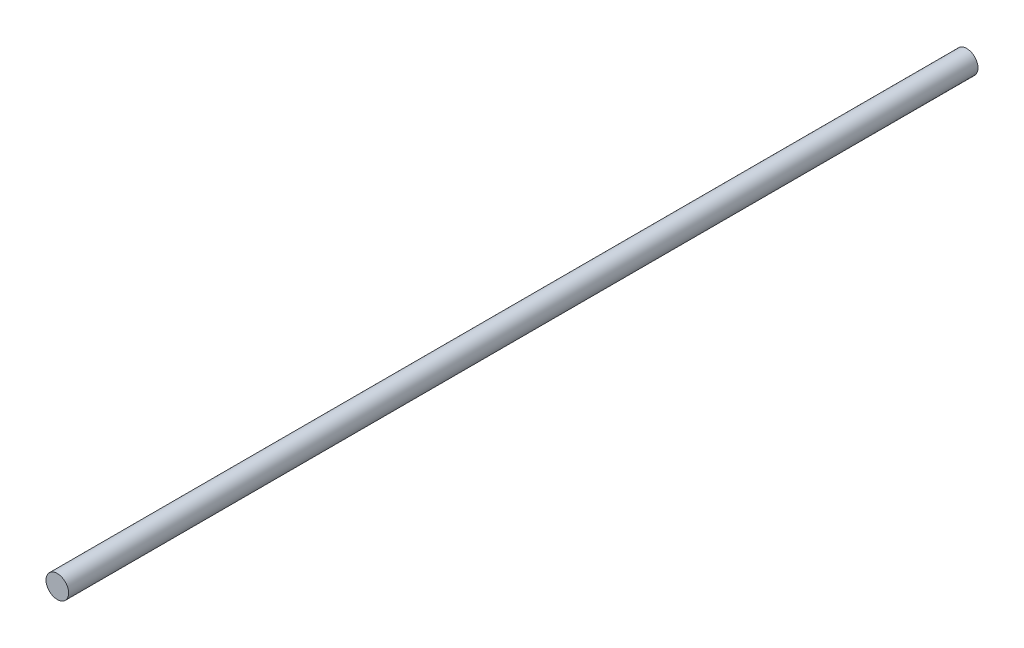
ISO-10303-21;
HEADER;
FILE_DESCRIPTION(('STEP AP214'),'2;1');
FILE_NAME('part.step','',(''),(''),'','','');
FILE_SCHEMA(('AUTOMOTIVE_DESIGN { 1 0 10303 214 1 1 1 1 }'));
ENDSEC;
DATA;
#1=APPLICATION_CONTEXT('core data for automotive mechanical design processes');
#2=APPLICATION_PROTOCOL_DEFINITION('international standard','automotive_design',2000,#1);
#3=PRODUCT_CONTEXT('',#1,'mechanical');
#4=PRODUCT('Part','Part','',(#3));
#5=PRODUCT_RELATED_PRODUCT_CATEGORY('part','',(#4));
#6=PRODUCT_DEFINITION_FORMATION('','',#4);
#7=PRODUCT_DEFINITION_CONTEXT('part definition',#1,'design');
#8=PRODUCT_DEFINITION('design','',#6,#7);
#9=PRODUCT_DEFINITION_SHAPE('','',#8);
#10=(LENGTH_UNIT() NAMED_UNIT(*) SI_UNIT(.MILLI.,.METRE.));
#11=(NAMED_UNIT(*) PLANE_ANGLE_UNIT() SI_UNIT($,.RADIAN.));
#12=(NAMED_UNIT(*) SI_UNIT($,.STERADIAN.) SOLID_ANGLE_UNIT());
#13=UNCERTAINTY_MEASURE_WITH_UNIT(LENGTH_MEASURE(1.E-05),#10,'distance_accuracy_value','');
#14=(GEOMETRIC_REPRESENTATION_CONTEXT(3) GLOBAL_UNCERTAINTY_ASSIGNED_CONTEXT((#13)) GLOBAL_UNIT_ASSIGNED_CONTEXT((#10,
#11,#12)) REPRESENTATION_CONTEXT('',''));
#15=CARTESIAN_POINT('',(0.,0.,0.));
#16=DIRECTION('',(0.,0.,1.));
#17=DIRECTION('',(1.,0.,0.));
#18=AXIS2_PLACEMENT_3D('',#15,#16,#17);
#19=CARTESIAN_POINT('',(0.,0.,482.6));
#20=DIRECTION('',(0.,0.,-1.));
#21=DIRECTION('',(-1.,0.,0.));
#22=AXIS2_PLACEMENT_3D('',#19,#20,#21);
#23=CYLINDRICAL_SURFACE('',#22,6.);
#24=CARTESIAN_POINT('',(0.,0.,482.6));
#25=DIRECTION('',(0.,0.,1.));
#26=DIRECTION('',(1.,0.,0.));
#27=AXIS2_PLACEMENT_3D('',#24,#25,#26);
#28=CIRCLE('',#27,6.);
#29=CARTESIAN_POINT('',(-6.,0.,482.6));
#30=VERTEX_POINT('',#29);
#31=EDGE_CURVE('E10',#30,#30,#28,.T.);
#32=CARTESIAN_POINT('',(0.,0.,0.));
#33=DIRECTION('',(0.,0.,1.));
#34=DIRECTION('',(1.,0.,0.));
#35=AXIS2_PLACEMENT_3D('',#32,#33,#34);
#36=CIRCLE('',#35,6.);
#37=CARTESIAN_POINT('',(-6.,0.,0.));
#38=VERTEX_POINT('',#37);
#39=EDGE_CURVE('E34',#38,#38,#36,.T.);
#40=CARTESIAN_POINT('',(-6.,0.,482.6));
#41=CARTESIAN_POINT('',(-6.,0.,477.572916666667));
#42=CARTESIAN_POINT('',(-6.,0.,472.545833333333));
#43=CARTESIAN_POINT('',(-6.,0.,462.491666666667));
#44=CARTESIAN_POINT('',(-6.,0.,457.464583333333));
#45=CARTESIAN_POINT('',(-6.,0.,447.410416666667));
#46=CARTESIAN_POINT('',(-6.,0.,442.383333333333));
#47=CARTESIAN_POINT('',(-6.,0.,432.329166666667));
#48=CARTESIAN_POINT('',(-6.,0.,427.302083333333));
#49=CARTESIAN_POINT('',(-6.,0.,417.247916666667));
#50=CARTESIAN_POINT('',(-6.,0.,412.220833333333));
#51=CARTESIAN_POINT('',(-6.,0.,402.166666666667));
#52=CARTESIAN_POINT('',(-6.,0.,397.139583333333));
#53=CARTESIAN_POINT('',(-6.,0.,387.085416666667));
#54=CARTESIAN_POINT('',(-6.,0.,382.058333333333));
#55=CARTESIAN_POINT('',(-6.,0.,372.004166666667));
#56=CARTESIAN_POINT('',(-6.,0.,366.977083333333));
#57=CARTESIAN_POINT('',(-6.,0.,356.922916666667));
#58=CARTESIAN_POINT('',(-6.,0.,351.895833333333));
#59=CARTESIAN_POINT('',(-6.,0.,341.841666666667));
#60=CARTESIAN_POINT('',(-6.,0.,336.814583333333));
#61=CARTESIAN_POINT('',(-6.,0.,326.760416666667));
#62=CARTESIAN_POINT('',(-6.,0.,321.733333333333));
#63=CARTESIAN_POINT('',(-6.,0.,311.679166666667));
#64=CARTESIAN_POINT('',(-6.,0.,306.652083333333));
#65=CARTESIAN_POINT('',(-6.,0.,296.597916666667));
#66=CARTESIAN_POINT('',(-6.,0.,291.570833333333));
#67=CARTESIAN_POINT('',(-6.,0.,281.516666666667));
#68=CARTESIAN_POINT('',(-6.,0.,276.489583333333));
#69=CARTESIAN_POINT('',(-6.,0.,266.435416666667));
#70=CARTESIAN_POINT('',(-6.,0.,261.408333333333));
#71=CARTESIAN_POINT('',(-6.,0.,251.354166666667));
#72=CARTESIAN_POINT('',(-6.,0.,246.327083333333));
#73=CARTESIAN_POINT('',(-6.,0.,236.272916666667));
#74=CARTESIAN_POINT('',(-6.,0.,231.245833333333));
#75=CARTESIAN_POINT('',(-6.,0.,221.191666666667));
#76=CARTESIAN_POINT('',(-6.,0.,216.164583333333));
#77=CARTESIAN_POINT('',(-6.,0.,206.110416666667));
#78=CARTESIAN_POINT('',(-6.,0.,201.083333333333));
#79=CARTESIAN_POINT('',(-6.,0.,191.029166666667));
#80=CARTESIAN_POINT('',(-6.,0.,186.002083333333));
#81=CARTESIAN_POINT('',(-6.,0.,175.947916666667));
#82=CARTESIAN_POINT('',(-6.,0.,170.920833333333));
#83=CARTESIAN_POINT('',(-6.,0.,160.866666666667));
#84=CARTESIAN_POINT('',(-6.,0.,155.839583333333));
#85=CARTESIAN_POINT('',(-6.,0.,145.785416666667));
#86=CARTESIAN_POINT('',(-6.,0.,140.758333333333));
#87=CARTESIAN_POINT('',(-6.,0.,130.704166666667));
#88=CARTESIAN_POINT('',(-6.,0.,125.677083333333));
#89=CARTESIAN_POINT('',(-6.,0.,115.622916666667));
#90=CARTESIAN_POINT('',(-6.,0.,110.595833333333));
#91=CARTESIAN_POINT('',(-6.,0.,100.541666666667));
#92=CARTESIAN_POINT('',(-6.,0.,95.5145833333333));
#93=CARTESIAN_POINT('',(-6.,0.,85.4604166666667));
#94=CARTESIAN_POINT('',(-6.,0.,80.4333333333333));
#95=CARTESIAN_POINT('',(-6.,0.,70.3791666666667));
#96=CARTESIAN_POINT('',(-6.,0.,65.3520833333334));
#97=CARTESIAN_POINT('',(-6.,0.,55.2979166666667));
#98=CARTESIAN_POINT('',(-6.,0.,50.2708333333334));
#99=CARTESIAN_POINT('',(-6.,0.,40.2166666666667));
#100=CARTESIAN_POINT('',(-6.,0.,35.1895833333333));
#101=CARTESIAN_POINT('',(-6.,0.,25.1354166666667));
#102=CARTESIAN_POINT('',(-6.,0.,20.1083333333333));
#103=CARTESIAN_POINT('',(-6.,0.,10.0541666666667));
#104=CARTESIAN_POINT('',(-6.,0.,5.02708333333333));
#105=CARTESIAN_POINT('',(-6.,0.,0.));
#106=B_SPLINE_CURVE_WITH_KNOTS('',3,(#40,#41,#42,#43,#44,#45,#46,#47,#48,#49,#50,#51,#52,#53,
#54,#55,#56,#57,#58,#59,#60,#61,#62,#63,#64,#65,#66,#67,#68,#69,#70,#71,#72,#73,#74,#75,#76,#77,
#78,#79,#80,#81,#82,#83,#84,#85,#86,#87,#88,#89,#90,#91,#92,#93,#94,#95,#96,#97,#98,#99,#100,
#101,#102,#103,#104,#105),.UNSPECIFIED.,.F.,.F.,(4,2,2,2,2,2,2,2,2,2,2,2,2,2,2,2,2,2,2,2,2,2,2,
2,2,2,2,2,2,2,2,2,4),(0.,15.08125,30.1625,45.24375,60.325,75.40625,90.4875,105.56875,120.65,
135.73125,150.8125,165.89375,180.975,196.05625,211.1375,226.21875,241.3,256.38125,271.4625,
286.54375,301.625,316.70625,331.7875,346.86875,361.95,377.03125,392.1125,407.19375,422.275,
437.35625,452.4375,467.51875,482.6),.UNSPECIFIED.);
#107=EDGE_CURVE('BSEAM31',#30,#38,#106,.T.);
#108=ORIENTED_EDGE('',*,*,#31,.F.);
#109=ORIENTED_EDGE('',*,*,#39,.T.);
#110=ORIENTED_EDGE('',*,*,#107,.T.);
#111=ORIENTED_EDGE('',*,*,#107,.F.);
#112=EDGE_LOOP('',(#108,#110,#109,#111));
#113=FACE_BOUND('',#112,.T.);
#114=ADVANCED_FACE('F31',(#113),#23,.T.);
#115=CARTESIAN_POINT('',(0.,0.,482.6));
#116=DIRECTION('',(0.,0.,1.));
#117=DIRECTION('',(1.,0.,0.));
#118=AXIS2_PLACEMENT_3D('',#115,#116,#117);
#119=PLANE('',#118);
#120=ORIENTED_EDGE('',*,*,#31,.T.);
#121=EDGE_LOOP('',(#120));
#122=FACE_BOUND('',#121,.T.);
#123=ADVANCED_FACE('F46',(#122),#119,.T.);
#124=CARTESIAN_POINT('',(0.,0.,0.));
#125=DIRECTION('',(0.,0.,1.));
#126=DIRECTION('',(1.,0.,0.));
#127=AXIS2_PLACEMENT_3D('',#124,#125,#126);
#128=PLANE('',#127);
#129=ORIENTED_EDGE('',*,*,#39,.F.);
#130=EDGE_LOOP('',(#129));
#131=FACE_BOUND('',#130,.T.);
#132=ADVANCED_FACE('F44',(#131),#128,.F.);
#133=CLOSED_SHELL('',(#114,#123,#132));
#134=MANIFOLD_SOLID_BREP('B2',#133);
#135=ADVANCED_BREP_SHAPE_REPRESENTATION('',(#18,#134),#14);
#136=SHAPE_DEFINITION_REPRESENTATION(#9,#135);
ENDSEC;
END-ISO-10303-21;
